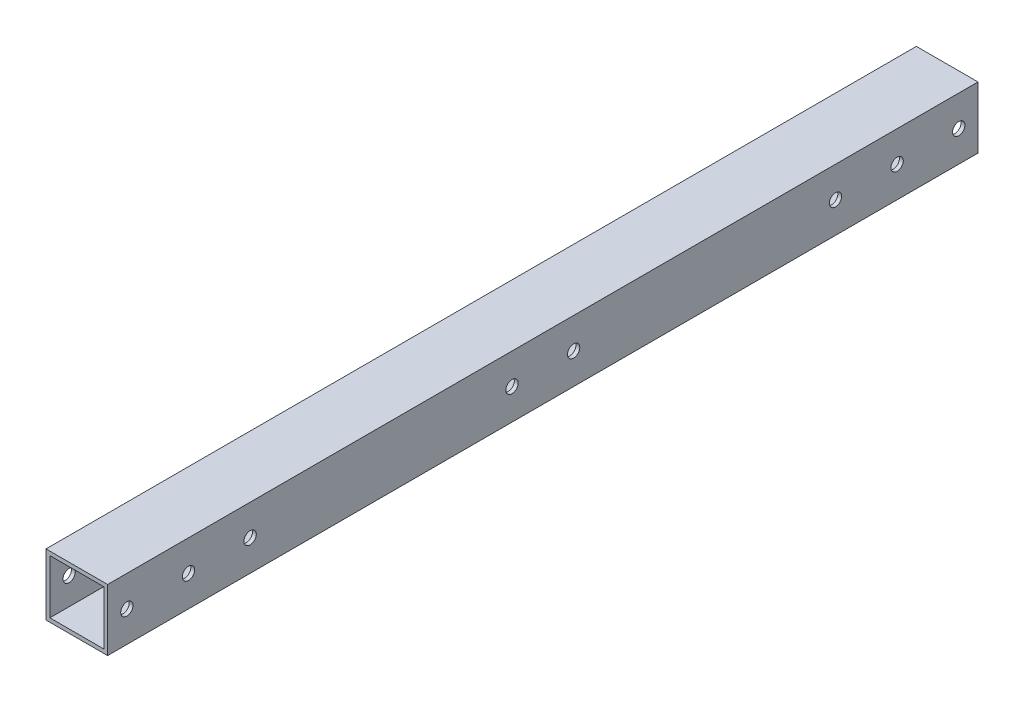
ISO-10303-21;
HEADER;
FILE_DESCRIPTION(('STEP AP214'),'2;1');
FILE_NAME('part.step','',(''),(''),'','','');
FILE_SCHEMA(('AUTOMOTIVE_DESIGN { 1 0 10303 214 1 1 1 1 }'));
ENDSEC;
DATA;
#1=APPLICATION_CONTEXT('core data for automotive mechanical design processes');
#2=APPLICATION_PROTOCOL_DEFINITION('international standard','automotive_design',2000,#1);
#3=PRODUCT_CONTEXT('',#1,'mechanical');
#4=PRODUCT('Part','Part','',(#3));
#5=PRODUCT_RELATED_PRODUCT_CATEGORY('part','',(#4));
#6=PRODUCT_DEFINITION_FORMATION('','',#4);
#7=PRODUCT_DEFINITION_CONTEXT('part definition',#1,'design');
#8=PRODUCT_DEFINITION('design','',#6,#7);
#9=PRODUCT_DEFINITION_SHAPE('','',#8);
#10=(LENGTH_UNIT() NAMED_UNIT(*) SI_UNIT(.MILLI.,.METRE.));
#11=(NAMED_UNIT(*) PLANE_ANGLE_UNIT() SI_UNIT($,.RADIAN.));
#12=(NAMED_UNIT(*) SI_UNIT($,.STERADIAN.) SOLID_ANGLE_UNIT());
#13=UNCERTAINTY_MEASURE_WITH_UNIT(LENGTH_MEASURE(1.E-05),#10,'distance_accuracy_value','');
#14=(GEOMETRIC_REPRESENTATION_CONTEXT(3) GLOBAL_UNCERTAINTY_ASSIGNED_CONTEXT((#13)) GLOBAL_UNIT_ASSIGNED_CONTEXT((#10,
#11,#12)) REPRESENTATION_CONTEXT('',''));
#15=CARTESIAN_POINT('',(0.,0.,0.));
#16=DIRECTION('',(0.,0.,1.));
#17=DIRECTION('',(1.,0.,0.));
#18=AXIS2_PLACEMENT_3D('',#15,#16,#17);
#19=CARTESIAN_POINT('',(0.,0.,358.775));
#20=DIRECTION('',(0.,0.,-1.));
#21=DIRECTION('',(-1.,0.,0.));
#22=AXIS2_PLACEMENT_3D('',#19,#20,#21);
#23=PLANE('',#22);
#24=DIRECTION('',(0.,-1.,0.));
#25=VECTOR('',#24,1.);
#26=CARTESIAN_POINT('',(0.,0.,358.775));
#27=LINE('',#26,#25);
#28=CARTESIAN_POINT('',(0.,25.4,358.775));
#29=VERTEX_POINT('',#28);
#30=CARTESIAN_POINT('',(0.,0.,358.775));
#31=VERTEX_POINT('',#30);
#32=EDGE_CURVE('E157',#29,#31,#27,.T.);
#33=ORIENTED_EDGE('',*,*,#32,.T.);
#34=DIRECTION('',(1.,0.,0.));
#35=VECTOR('',#34,1.);
#36=CARTESIAN_POINT('',(0.,0.,358.775));
#37=LINE('',#36,#35);
#38=CARTESIAN_POINT('',(25.4,0.,358.775));
#39=VERTEX_POINT('',#38);
#40=EDGE_CURVE('E161',#31,#39,#37,.T.);
#41=ORIENTED_EDGE('',*,*,#40,.T.);
#42=DIRECTION('',(0.,1.,0.));
#43=VECTOR('',#42,1.);
#44=CARTESIAN_POINT('',(25.4,0.,358.775));
#45=LINE('',#44,#43);
#46=CARTESIAN_POINT('',(25.4,25.4,358.775));
#47=VERTEX_POINT('',#46);
#48=EDGE_CURVE('E165',#39,#47,#45,.T.);
#49=ORIENTED_EDGE('',*,*,#48,.T.);
#50=DIRECTION('',(-1.,0.,0.));
#51=VECTOR('',#50,1.);
#52=CARTESIAN_POINT('',(0.,25.4,358.775));
#53=LINE('',#52,#51);
#54=EDGE_CURVE('E168',#47,#29,#53,.T.);
#55=ORIENTED_EDGE('',*,*,#54,.T.);
#56=EDGE_LOOP('',(#33,#41,#49,#55));
#57=FACE_BOUND('',#56,.T.);
#58=DIRECTION('',(0.,-1.,0.));
#59=VECTOR('',#58,1.);
#60=CARTESIAN_POINT('',(1.5875,1.5875,358.775));
#61=LINE('',#60,#59);
#62=CARTESIAN_POINT('',(1.5875,23.8125,358.775));
#63=VERTEX_POINT('',#62);
#64=CARTESIAN_POINT('',(1.5875,1.5875,358.775));
#65=VERTEX_POINT('',#64);
#66=EDGE_CURVE('E107',#63,#65,#61,.T.);
#67=ORIENTED_EDGE('',*,*,#66,.F.);
#68=DIRECTION('',(-1.,0.,0.));
#69=VECTOR('',#68,1.);
#70=CARTESIAN_POINT('',(1.5875,23.8125,358.775));
#71=LINE('',#70,#69);
#72=CARTESIAN_POINT('',(23.8125,23.8125,358.775));
#73=VERTEX_POINT('',#72);
#74=EDGE_CURVE('E133',#73,#63,#71,.T.);
#75=ORIENTED_EDGE('',*,*,#74,.F.);
#76=DIRECTION('',(0.,1.,0.));
#77=VECTOR('',#76,1.);
#78=CARTESIAN_POINT('',(23.8125,1.5875,358.775));
#79=LINE('',#78,#77);
#80=CARTESIAN_POINT('',(23.8125,1.5875,358.775));
#81=VERTEX_POINT('',#80);
#82=EDGE_CURVE('E129',#81,#73,#79,.T.);
#83=ORIENTED_EDGE('',*,*,#82,.F.);
#84=DIRECTION('',(1.,0.,0.));
#85=VECTOR('',#84,1.);
#86=CARTESIAN_POINT('',(1.5875,1.5875,358.775));
#87=LINE('',#86,#85);
#88=EDGE_CURVE('E116',#65,#81,#87,.T.);
#89=ORIENTED_EDGE('',*,*,#88,.F.);
#90=EDGE_LOOP('',(#67,#75,#83,#89));
#91=FACE_BOUND('',#90,.T.);
#92=ADVANCED_FACE('F39',(#57,#91),#23,.F.);
#93=CARTESIAN_POINT('',(0.,0.,0.));
#94=DIRECTION('',(0.,0.,-1.));
#95=DIRECTION('',(-1.,0.,0.));
#96=AXIS2_PLACEMENT_3D('',#93,#94,#95);
#97=PLANE('',#96);
#98=DIRECTION('',(0.,-1.,0.));
#99=VECTOR('',#98,1.);
#100=CARTESIAN_POINT('',(0.,0.,0.));
#101=LINE('',#100,#99);
#102=CARTESIAN_POINT('',(0.,25.4,0.));
#103=VERTEX_POINT('',#102);
#104=CARTESIAN_POINT('',(0.,0.,0.));
#105=VERTEX_POINT('',#104);
#106=EDGE_CURVE('E125',#103,#105,#101,.T.);
#107=ORIENTED_EDGE('',*,*,#106,.F.);
#108=DIRECTION('',(-1.,0.,0.));
#109=VECTOR('',#108,1.);
#110=CARTESIAN_POINT('',(0.,25.4,0.));
#111=LINE('',#110,#109);
#112=CARTESIAN_POINT('',(25.4,25.4,0.));
#113=VERTEX_POINT('',#112);
#114=EDGE_CURVE('E162',#113,#103,#111,.T.);
#115=ORIENTED_EDGE('',*,*,#114,.F.);
#116=DIRECTION('',(0.,1.,0.));
#117=VECTOR('',#116,1.);
#118=CARTESIAN_POINT('',(25.4,0.,0.));
#119=LINE('',#118,#117);
#120=CARTESIAN_POINT('',(25.4,0.,0.));
#121=VERTEX_POINT('',#120);
#122=EDGE_CURVE('E178',#121,#113,#119,.T.);
#123=ORIENTED_EDGE('',*,*,#122,.F.);
#124=DIRECTION('',(1.,0.,0.));
#125=VECTOR('',#124,1.);
#126=CARTESIAN_POINT('',(0.,0.,0.));
#127=LINE('',#126,#125);
#128=EDGE_CURVE('E175',#105,#121,#127,.T.);
#129=ORIENTED_EDGE('',*,*,#128,.F.);
#130=EDGE_LOOP('',(#107,#115,#123,#129));
#131=FACE_BOUND('',#130,.T.);
#132=DIRECTION('',(-1.,0.,0.));
#133=VECTOR('',#132,1.);
#134=CARTESIAN_POINT('',(1.5875,23.8125,0.));
#135=LINE('',#134,#133);
#136=CARTESIAN_POINT('',(23.8125,23.8125,0.));
#137=VERTEX_POINT('',#136);
#138=CARTESIAN_POINT('',(1.5875,23.8125,0.));
#139=VERTEX_POINT('',#138);
#140=EDGE_CURVE('E117',#137,#139,#135,.T.);
#141=ORIENTED_EDGE('',*,*,#140,.T.);
#142=DIRECTION('',(0.,-1.,0.));
#143=VECTOR('',#142,1.);
#144=CARTESIAN_POINT('',(1.5875,1.5875,0.));
#145=LINE('',#144,#143);
#146=CARTESIAN_POINT('',(1.5875,1.5875,0.));
#147=VERTEX_POINT('',#146);
#148=EDGE_CURVE('E65',#139,#147,#145,.T.);
#149=ORIENTED_EDGE('',*,*,#148,.T.);
#150=DIRECTION('',(1.,0.,0.));
#151=VECTOR('',#150,1.);
#152=CARTESIAN_POINT('',(1.5875,1.5875,0.));
#153=LINE('',#152,#151);
#154=CARTESIAN_POINT('',(23.8125,1.5875,0.));
#155=VERTEX_POINT('',#154);
#156=EDGE_CURVE('E123',#147,#155,#153,.T.);
#157=ORIENTED_EDGE('',*,*,#156,.T.);
#158=DIRECTION('',(0.,1.,0.));
#159=VECTOR('',#158,1.);
#160=CARTESIAN_POINT('',(23.8125,1.5875,0.));
#161=LINE('',#160,#159);
#162=EDGE_CURVE('E144',#155,#137,#161,.T.);
#163=ORIENTED_EDGE('',*,*,#162,.T.);
#164=EDGE_LOOP('',(#141,#149,#157,#163));
#165=FACE_BOUND('',#164,.T.);
#166=ADVANCED_FACE('F270',(#131,#165),#97,.T.);
#167=CARTESIAN_POINT('',(0.,0.,358.775));
#168=DIRECTION('',(1.,0.,0.));
#169=DIRECTION('',(0.,0.,-1.));
#170=AXIS2_PLACEMENT_3D('',#167,#168,#169);
#171=PLANE('',#170);
#172=CARTESIAN_POINT('',(0.,12.7,350.8375));
#173=DIRECTION('',(1.,0.,0.));
#174=DIRECTION('',(0.,0.,-1.));
#175=AXIS2_PLACEMENT_3D('',#172,#173,#174);
#176=CIRCLE('',#175,2.54000000000001);
#177=CARTESIAN_POINT('',(0.,12.7,348.2975));
#178=VERTEX_POINT('',#177);
#179=EDGE_CURVE('E198',#178,#178,#176,.T.);
#180=ORIENTED_EDGE('',*,*,#179,.T.);
#181=EDGE_LOOP('',(#180));
#182=FACE_BOUND('',#181,.T.);
#183=CARTESIAN_POINT('',(0.,12.7,325.4375));
#184=DIRECTION('',(1.,0.,0.));
#185=DIRECTION('',(0.,0.,-1.));
#186=AXIS2_PLACEMENT_3D('',#183,#184,#185);
#187=CIRCLE('',#186,2.54000000000001);
#188=CARTESIAN_POINT('',(0.,12.7,322.8975));
#189=VERTEX_POINT('',#188);
#190=EDGE_CURVE('E326',#189,#189,#187,.T.);
#191=ORIENTED_EDGE('',*,*,#190,.T.);
#192=EDGE_LOOP('',(#191));
#193=FACE_BOUND('',#192,.T.);
#194=CARTESIAN_POINT('',(0.,12.7,300.0375));
#195=DIRECTION('',(1.,0.,0.));
#196=DIRECTION('',(0.,0.,-1.));
#197=AXIS2_PLACEMENT_3D('',#194,#195,#196);
#198=CIRCLE('',#197,2.54000000000001);
#199=CARTESIAN_POINT('',(0.,12.7,297.4975));
#200=VERTEX_POINT('',#199);
#201=EDGE_CURVE('E330',#200,#200,#198,.T.);
#202=ORIENTED_EDGE('',*,*,#201,.T.);
#203=EDGE_LOOP('',(#202));
#204=FACE_BOUND('',#203,.T.);
#205=CARTESIAN_POINT('',(0.,12.7,192.0875));
#206=DIRECTION('',(1.,0.,0.));
#207=DIRECTION('',(0.,0.,-1.));
#208=AXIS2_PLACEMENT_3D('',#205,#206,#207);
#209=CIRCLE('',#208,2.53999999999998);
#210=CARTESIAN_POINT('',(0.,12.7,189.5475));
#211=VERTEX_POINT('',#210);
#212=EDGE_CURVE('E334',#211,#211,#209,.T.);
#213=ORIENTED_EDGE('',*,*,#212,.T.);
#214=EDGE_LOOP('',(#213));
#215=FACE_BOUND('',#214,.T.);
#216=CARTESIAN_POINT('',(0.,12.7,166.6875));
#217=DIRECTION('',(1.,0.,0.));
#218=DIRECTION('',(0.,0.,1.));
#219=AXIS2_PLACEMENT_3D('',#216,#217,#218);
#220=CIRCLE('',#219,2.53999999999998);
#221=CARTESIAN_POINT('',(0.,12.7,169.2275));
#222=VERTEX_POINT('',#221);
#223=EDGE_CURVE('E338',#222,#222,#220,.T.);
#224=ORIENTED_EDGE('',*,*,#223,.T.);
#225=EDGE_LOOP('',(#224));
#226=FACE_BOUND('',#225,.T.);
#227=CARTESIAN_POINT('',(0.,12.7,58.7374999999999));
#228=DIRECTION('',(1.,0.,0.));
#229=DIRECTION('',(0.,0.,1.));
#230=AXIS2_PLACEMENT_3D('',#227,#228,#229);
#231=CIRCLE('',#230,2.54000000000001);
#232=CARTESIAN_POINT('',(0.,12.7,61.2774999999999));
#233=VERTEX_POINT('',#232);
#234=EDGE_CURVE('E342',#233,#233,#231,.T.);
#235=ORIENTED_EDGE('',*,*,#234,.T.);
#236=EDGE_LOOP('',(#235));
#237=FACE_BOUND('',#236,.T.);
#238=CARTESIAN_POINT('',(0.,12.7,33.3375));
#239=DIRECTION('',(1.,0.,0.));
#240=DIRECTION('',(0.,0.,1.));
#241=AXIS2_PLACEMENT_3D('',#238,#239,#240);
#242=CIRCLE('',#241,2.53999999999998);
#243=CARTESIAN_POINT('',(0.,12.7,35.8774999999999));
#244=VERTEX_POINT('',#243);
#245=EDGE_CURVE('E346',#244,#244,#242,.T.);
#246=ORIENTED_EDGE('',*,*,#245,.T.);
#247=EDGE_LOOP('',(#246));
#248=FACE_BOUND('',#247,.T.);
#249=CARTESIAN_POINT('',(0.,12.7,7.93749999999999));
#250=DIRECTION('',(1.,0.,0.));
#251=DIRECTION('',(0.,0.,1.));
#252=AXIS2_PLACEMENT_3D('',#249,#250,#251);
#253=CIRCLE('',#252,2.53999999999998);
#254=CARTESIAN_POINT('',(0.,12.7,10.4775));
#255=VERTEX_POINT('',#254);
#256=EDGE_CURVE('E349',#255,#255,#253,.T.);
#257=ORIENTED_EDGE('',*,*,#256,.T.);
#258=EDGE_LOOP('',(#257));
#259=FACE_BOUND('',#258,.T.);
#260=ORIENTED_EDGE('',*,*,#106,.T.);
#261=DIRECTION('',(0.,0.,-1.));
#262=VECTOR('',#261,1.);
#263=CARTESIAN_POINT('',(0.,0.,358.775));
#264=LINE('',#263,#262);
#265=EDGE_CURVE('E11',#31,#105,#264,.T.);
#266=ORIENTED_EDGE('',*,*,#265,.F.);
#267=ORIENTED_EDGE('',*,*,#32,.F.);
#268=DIRECTION('',(0.,0.,-1.));
#269=VECTOR('',#268,1.);
#270=CARTESIAN_POINT('',(0.,25.4,358.775));
#271=LINE('',#270,#269);
#272=EDGE_CURVE('E171',#29,#103,#271,.T.);
#273=ORIENTED_EDGE('',*,*,#272,.T.);
#274=EDGE_LOOP('',(#260,#266,#267,#273));
#275=FACE_BOUND('',#274,.T.);
#276=ADVANCED_FACE('F41',(#182,#193,#204,#215,#226,#237,#248,#259,#275),#171,.F.);
#277=CARTESIAN_POINT('',(0.,0.,358.775));
#278=DIRECTION('',(0.,1.,0.));
#279=DIRECTION('',(0.,0.,1.));
#280=AXIS2_PLACEMENT_3D('',#277,#278,#279);
#281=PLANE('',#280);
#282=ORIENTED_EDGE('',*,*,#128,.T.);
#283=DIRECTION('',(0.,0.,-1.));
#284=VECTOR('',#283,1.);
#285=CARTESIAN_POINT('',(25.4,0.,358.775));
#286=LINE('',#285,#284);
#287=EDGE_CURVE('E49',#39,#121,#286,.T.);
#288=ORIENTED_EDGE('',*,*,#287,.F.);
#289=ORIENTED_EDGE('',*,*,#40,.F.);
#290=ORIENTED_EDGE('',*,*,#265,.T.);
#291=EDGE_LOOP('',(#282,#288,#289,#290));
#292=FACE_BOUND('',#291,.T.);
#293=ADVANCED_FACE('F298',(#292),#281,.F.);
#294=CARTESIAN_POINT('',(25.4,0.,358.775));
#295=DIRECTION('',(-1.,0.,0.));
#296=DIRECTION('',(0.,0.,1.));
#297=AXIS2_PLACEMENT_3D('',#294,#295,#296);
#298=PLANE('',#297);
#299=CARTESIAN_POINT('',(25.4,12.7,350.8375));
#300=DIRECTION('',(1.,0.,0.));
#301=DIRECTION('',(0.,0.,-1.));
#302=AXIS2_PLACEMENT_3D('',#299,#300,#301);
#303=CIRCLE('',#302,2.54000000000001);
#304=CARTESIAN_POINT('',(25.4,12.7,348.2975));
#305=VERTEX_POINT('',#304);
#306=EDGE_CURVE('E434',#305,#305,#303,.T.);
#307=ORIENTED_EDGE('',*,*,#306,.F.);
#308=EDGE_LOOP('',(#307));
#309=FACE_BOUND('',#308,.T.);
#310=CARTESIAN_POINT('',(25.4,12.7,325.4375));
#311=DIRECTION('',(1.,0.,0.));
#312=DIRECTION('',(0.,0.,-1.));
#313=AXIS2_PLACEMENT_3D('',#310,#311,#312);
#314=CIRCLE('',#313,2.54000000000001);
#315=CARTESIAN_POINT('',(25.4,12.7,322.8975));
#316=VERTEX_POINT('',#315);
#317=EDGE_CURVE('E435',#316,#316,#314,.T.);
#318=ORIENTED_EDGE('',*,*,#317,.F.);
#319=EDGE_LOOP('',(#318));
#320=FACE_BOUND('',#319,.T.);
#321=CARTESIAN_POINT('',(25.4,12.7,300.0375));
#322=DIRECTION('',(1.,0.,0.));
#323=DIRECTION('',(0.,0.,-1.));
#324=AXIS2_PLACEMENT_3D('',#321,#322,#323);
#325=CIRCLE('',#324,2.54000000000001);
#326=CARTESIAN_POINT('',(25.4,12.7,297.4975));
#327=VERTEX_POINT('',#326);
#328=EDGE_CURVE('E447',#327,#327,#325,.T.);
#329=ORIENTED_EDGE('',*,*,#328,.F.);
#330=EDGE_LOOP('',(#329));
#331=FACE_BOUND('',#330,.T.);
#332=CARTESIAN_POINT('',(25.4,12.7,192.0875));
#333=DIRECTION('',(1.,0.,0.));
#334=DIRECTION('',(0.,0.,-1.));
#335=AXIS2_PLACEMENT_3D('',#332,#333,#334);
#336=CIRCLE('',#335,2.53999999999998);
#337=CARTESIAN_POINT('',(25.4,12.7,189.5475));
#338=VERTEX_POINT('',#337);
#339=EDGE_CURVE('E453',#338,#338,#336,.T.);
#340=ORIENTED_EDGE('',*,*,#339,.F.);
#341=EDGE_LOOP('',(#340));
#342=FACE_BOUND('',#341,.T.);
#343=CARTESIAN_POINT('',(25.4,12.7,166.6875));
#344=DIRECTION('',(1.,0.,0.));
#345=DIRECTION('',(0.,0.,1.));
#346=AXIS2_PLACEMENT_3D('',#343,#344,#345);
#347=CIRCLE('',#346,2.53999999999998);
#348=CARTESIAN_POINT('',(25.4,12.7,169.2275));
#349=VERTEX_POINT('',#348);
#350=EDGE_CURVE('E459',#349,#349,#347,.T.);
#351=ORIENTED_EDGE('',*,*,#350,.F.);
#352=EDGE_LOOP('',(#351));
#353=FACE_BOUND('',#352,.T.);
#354=CARTESIAN_POINT('',(25.4,12.7,58.7374999999999));
#355=DIRECTION('',(1.,0.,0.));
#356=DIRECTION('',(0.,0.,1.));
#357=AXIS2_PLACEMENT_3D('',#354,#355,#356);
#358=CIRCLE('',#357,2.54000000000001);
#359=CARTESIAN_POINT('',(25.4,12.7,61.2774999999999));
#360=VERTEX_POINT('',#359);
#361=EDGE_CURVE('E465',#360,#360,#358,.T.);
#362=ORIENTED_EDGE('',*,*,#361,.F.);
#363=EDGE_LOOP('',(#362));
#364=FACE_BOUND('',#363,.T.);
#365=CARTESIAN_POINT('',(25.4,12.7,33.3375));
#366=DIRECTION('',(1.,0.,0.));
#367=DIRECTION('',(0.,0.,1.));
#368=AXIS2_PLACEMENT_3D('',#365,#366,#367);
#369=CIRCLE('',#368,2.53999999999998);
#370=CARTESIAN_POINT('',(25.4,12.7,35.8774999999999));
#371=VERTEX_POINT('',#370);
#372=EDGE_CURVE('E352',#371,#371,#369,.T.);
#373=ORIENTED_EDGE('',*,*,#372,.F.);
#374=EDGE_LOOP('',(#373));
#375=FACE_BOUND('',#374,.T.);
#376=CARTESIAN_POINT('',(25.4,12.7,7.93749999999999));
#377=DIRECTION('',(1.,0.,0.));
#378=DIRECTION('',(0.,0.,1.));
#379=AXIS2_PLACEMENT_3D('',#376,#377,#378);
#380=CIRCLE('',#379,2.53999999999998);
#381=CARTESIAN_POINT('',(25.4,12.7,10.4775));
#382=VERTEX_POINT('',#381);
#383=EDGE_CURVE('E353',#382,#382,#380,.T.);
#384=ORIENTED_EDGE('',*,*,#383,.F.);
#385=EDGE_LOOP('',(#384));
#386=FACE_BOUND('',#385,.T.);
#387=ORIENTED_EDGE('',*,*,#122,.T.);
#388=DIRECTION('',(0.,0.,-1.));
#389=VECTOR('',#388,1.);
#390=CARTESIAN_POINT('',(25.4,25.4,358.775));
#391=LINE('',#390,#389);
#392=EDGE_CURVE('E186',#47,#113,#391,.T.);
#393=ORIENTED_EDGE('',*,*,#392,.F.);
#394=ORIENTED_EDGE('',*,*,#48,.F.);
#395=ORIENTED_EDGE('',*,*,#287,.T.);
#396=EDGE_LOOP('',(#387,#393,#394,#395));
#397=FACE_BOUND('',#396,.T.);
#398=ADVANCED_FACE('F295',(#309,#320,#331,#342,#353,#364,#375,#386,#397),#298,.F.);
#399=CARTESIAN_POINT('',(0.,25.4,358.775));
#400=DIRECTION('',(0.,-1.,0.));
#401=DIRECTION('',(0.,0.,-1.));
#402=AXIS2_PLACEMENT_3D('',#399,#400,#401);
#403=PLANE('',#402);
#404=ORIENTED_EDGE('',*,*,#114,.T.);
#405=ORIENTED_EDGE('',*,*,#272,.F.);
#406=ORIENTED_EDGE('',*,*,#54,.F.);
#407=ORIENTED_EDGE('',*,*,#392,.T.);
#408=EDGE_LOOP('',(#404,#405,#406,#407));
#409=FACE_BOUND('',#408,.T.);
#410=ADVANCED_FACE('F292',(#409),#403,.F.);
#411=CARTESIAN_POINT('',(1.5875,1.5875,358.775));
#412=DIRECTION('',(1.,0.,0.));
#413=DIRECTION('',(0.,0.,-1.));
#414=AXIS2_PLACEMENT_3D('',#411,#412,#413);
#415=PLANE('',#414);
#416=CARTESIAN_POINT('',(1.5875,12.7,350.8375));
#417=DIRECTION('',(1.,0.,0.));
#418=DIRECTION('',(0.,0.,-1.));
#419=AXIS2_PLACEMENT_3D('',#416,#417,#418);
#420=CIRCLE('',#419,2.54000000000001);
#421=CARTESIAN_POINT('',(1.5875,12.7,348.2975));
#422=VERTEX_POINT('',#421);
#423=EDGE_CURVE('E141',#422,#422,#420,.T.);
#424=ORIENTED_EDGE('',*,*,#423,.F.);
#425=EDGE_LOOP('',(#424));
#426=FACE_BOUND('',#425,.T.);
#427=CARTESIAN_POINT('',(1.5875,12.7,325.4375));
#428=DIRECTION('',(1.,0.,0.));
#429=DIRECTION('',(0.,0.,-1.));
#430=AXIS2_PLACEMENT_3D('',#427,#428,#429);
#431=CIRCLE('',#430,2.54000000000001);
#432=CARTESIAN_POINT('',(1.5875,12.7,322.8975));
#433=VERTEX_POINT('',#432);
#434=EDGE_CURVE('E226',#433,#433,#431,.T.);
#435=ORIENTED_EDGE('',*,*,#434,.F.);
#436=EDGE_LOOP('',(#435));
#437=FACE_BOUND('',#436,.T.);
#438=CARTESIAN_POINT('',(1.5875,12.7,300.0375));
#439=DIRECTION('',(1.,0.,0.));
#440=DIRECTION('',(0.,0.,-1.));
#441=AXIS2_PLACEMENT_3D('',#438,#439,#440);
#442=CIRCLE('',#441,2.54000000000001);
#443=CARTESIAN_POINT('',(1.5875,12.7,297.4975));
#444=VERTEX_POINT('',#443);
#445=EDGE_CURVE('E222',#444,#444,#442,.T.);
#446=ORIENTED_EDGE('',*,*,#445,.F.);
#447=EDGE_LOOP('',(#446));
#448=FACE_BOUND('',#447,.T.);
#449=CARTESIAN_POINT('',(1.5875,12.7,192.0875));
#450=DIRECTION('',(1.,0.,0.));
#451=DIRECTION('',(0.,0.,-1.));
#452=AXIS2_PLACEMENT_3D('',#449,#450,#451);
#453=CIRCLE('',#452,2.53999999999998);
#454=CARTESIAN_POINT('',(1.5875,12.7,189.5475));
#455=VERTEX_POINT('',#454);
#456=EDGE_CURVE('E218',#455,#455,#453,.T.);
#457=ORIENTED_EDGE('',*,*,#456,.F.);
#458=EDGE_LOOP('',(#457));
#459=FACE_BOUND('',#458,.T.);
#460=CARTESIAN_POINT('',(1.5875,12.7,166.6875));
#461=DIRECTION('',(1.,0.,0.));
#462=DIRECTION('',(0.,0.,-1.));
#463=AXIS2_PLACEMENT_3D('',#460,#461,#462);
#464=CIRCLE('',#463,2.53999999999998);
#465=CARTESIAN_POINT('',(1.5875,12.7,164.1475));
#466=VERTEX_POINT('',#465);
#467=EDGE_CURVE('E213',#466,#466,#464,.T.);
#468=ORIENTED_EDGE('',*,*,#467,.F.);
#469=EDGE_LOOP('',(#468));
#470=FACE_BOUND('',#469,.T.);
#471=CARTESIAN_POINT('',(1.5875,12.7,58.7374999999999));
#472=DIRECTION('',(1.,0.,0.));
#473=DIRECTION('',(0.,0.,-1.));
#474=AXIS2_PLACEMENT_3D('',#471,#472,#473);
#475=CIRCLE('',#474,2.54000000000001);
#476=CARTESIAN_POINT('',(1.5875,12.7,56.1974999999999));
#477=VERTEX_POINT('',#476);
#478=EDGE_CURVE('E208',#477,#477,#475,.T.);
#479=ORIENTED_EDGE('',*,*,#478,.F.);
#480=EDGE_LOOP('',(#479));
#481=FACE_BOUND('',#480,.T.);
#482=CARTESIAN_POINT('',(1.5875,12.7,33.3375));
#483=DIRECTION('',(1.,0.,0.));
#484=DIRECTION('',(0.,0.,-1.));
#485=AXIS2_PLACEMENT_3D('',#482,#483,#484);
#486=CIRCLE('',#485,2.53999999999998);
#487=CARTESIAN_POINT('',(1.5875,12.7,30.7975));
#488=VERTEX_POINT('',#487);
#489=EDGE_CURVE('E203',#488,#488,#486,.T.);
#490=ORIENTED_EDGE('',*,*,#489,.F.);
#491=EDGE_LOOP('',(#490));
#492=FACE_BOUND('',#491,.T.);
#493=CARTESIAN_POINT('',(1.5875,12.7,7.93749999999999));
#494=DIRECTION('',(1.,0.,0.));
#495=DIRECTION('',(0.,0.,-1.));
#496=AXIS2_PLACEMENT_3D('',#493,#494,#495);
#497=CIRCLE('',#496,2.53999999999998);
#498=CARTESIAN_POINT('',(1.5875,12.7,5.3975));
#499=VERTEX_POINT('',#498);
#500=EDGE_CURVE('E197',#499,#499,#497,.T.);
#501=ORIENTED_EDGE('',*,*,#500,.F.);
#502=EDGE_LOOP('',(#501));
#503=FACE_BOUND('',#502,.T.);
#504=ORIENTED_EDGE('',*,*,#148,.F.);
#505=DIRECTION('',(0.,0.,-1.));
#506=VECTOR('',#505,1.);
#507=CARTESIAN_POINT('',(1.5875,23.8125,358.775));
#508=LINE('',#507,#506);
#509=EDGE_CURVE('E111',#63,#139,#508,.T.);
#510=ORIENTED_EDGE('',*,*,#509,.F.);
#511=ORIENTED_EDGE('',*,*,#66,.T.);
#512=DIRECTION('',(0.,0.,-1.));
#513=VECTOR('',#512,1.);
#514=CARTESIAN_POINT('',(1.5875,1.5875,358.775));
#515=LINE('',#514,#513);
#516=EDGE_CURVE('E110',#65,#147,#515,.T.);
#517=ORIENTED_EDGE('',*,*,#516,.T.);
#518=EDGE_LOOP('',(#504,#510,#511,#517));
#519=FACE_BOUND('',#518,.T.);
#520=ADVANCED_FACE('F109',(#426,#437,#448,#459,#470,#481,#492,#503,#519),#415,.T.);
#521=CARTESIAN_POINT('',(1.5875,1.5875,358.775));
#522=DIRECTION('',(0.,1.,0.));
#523=DIRECTION('',(0.,0.,1.));
#524=AXIS2_PLACEMENT_3D('',#521,#522,#523);
#525=PLANE('',#524);
#526=ORIENTED_EDGE('',*,*,#156,.F.);
#527=ORIENTED_EDGE('',*,*,#516,.F.);
#528=ORIENTED_EDGE('',*,*,#88,.T.);
#529=DIRECTION('',(0.,0.,-1.));
#530=VECTOR('',#529,1.);
#531=CARTESIAN_POINT('',(23.8125,1.5875,358.775));
#532=LINE('',#531,#530);
#533=EDGE_CURVE('E126',#81,#155,#532,.T.);
#534=ORIENTED_EDGE('',*,*,#533,.T.);
#535=EDGE_LOOP('',(#526,#527,#528,#534));
#536=FACE_BOUND('',#535,.T.);
#537=ADVANCED_FACE('F120',(#536),#525,.T.);
#538=CARTESIAN_POINT('',(23.8125,1.5875,358.775));
#539=DIRECTION('',(-1.,0.,0.));
#540=DIRECTION('',(0.,0.,1.));
#541=AXIS2_PLACEMENT_3D('',#538,#539,#540);
#542=PLANE('',#541);
#543=CARTESIAN_POINT('',(23.8125,12.7,350.8375));
#544=DIRECTION('',(-1.,0.,0.));
#545=DIRECTION('',(0.,0.,1.));
#546=AXIS2_PLACEMENT_3D('',#543,#544,#545);
#547=CIRCLE('',#546,2.54000000000001);
#548=CARTESIAN_POINT('',(23.8125,12.7,353.3775));
#549=VERTEX_POINT('',#548);
#550=EDGE_CURVE('E43',#549,#549,#547,.T.);
#551=ORIENTED_EDGE('',*,*,#550,.F.);
#552=EDGE_LOOP('',(#551));
#553=FACE_BOUND('',#552,.T.);
#554=CARTESIAN_POINT('',(23.8125,12.7,325.4375));
#555=DIRECTION('',(-1.,0.,0.));
#556=DIRECTION('',(0.,0.,1.));
#557=AXIS2_PLACEMENT_3D('',#554,#555,#556);
#558=CIRCLE('',#557,2.54000000000001);
#559=CARTESIAN_POINT('',(23.8125,12.7,327.9775));
#560=VERTEX_POINT('',#559);
#561=EDGE_CURVE('E223',#560,#560,#558,.T.);
#562=ORIENTED_EDGE('',*,*,#561,.F.);
#563=EDGE_LOOP('',(#562));
#564=FACE_BOUND('',#563,.T.);
#565=CARTESIAN_POINT('',(23.8125,12.7,300.0375));
#566=DIRECTION('',(-1.,0.,0.));
#567=DIRECTION('',(0.,0.,1.));
#568=AXIS2_PLACEMENT_3D('',#565,#566,#567);
#569=CIRCLE('',#568,2.54000000000001);
#570=CARTESIAN_POINT('',(23.8125,12.7,302.5775));
#571=VERTEX_POINT('',#570);
#572=EDGE_CURVE('E219',#571,#571,#569,.T.);
#573=ORIENTED_EDGE('',*,*,#572,.F.);
#574=EDGE_LOOP('',(#573));
#575=FACE_BOUND('',#574,.T.);
#576=CARTESIAN_POINT('',(23.8125,12.7,192.0875));
#577=DIRECTION('',(-1.,0.,0.));
#578=DIRECTION('',(0.,0.,1.));
#579=AXIS2_PLACEMENT_3D('',#576,#577,#578);
#580=CIRCLE('',#579,2.53999999999998);
#581=CARTESIAN_POINT('',(23.8125,12.7,194.6275));
#582=VERTEX_POINT('',#581);
#583=EDGE_CURVE('E214',#582,#582,#580,.T.);
#584=ORIENTED_EDGE('',*,*,#583,.F.);
#585=EDGE_LOOP('',(#584));
#586=FACE_BOUND('',#585,.T.);
#587=CARTESIAN_POINT('',(23.8125,12.7,166.6875));
#588=DIRECTION('',(-1.,0.,0.));
#589=DIRECTION('',(0.,0.,1.));
#590=AXIS2_PLACEMENT_3D('',#587,#588,#589);
#591=CIRCLE('',#590,2.53999999999998);
#592=CARTESIAN_POINT('',(23.8125,12.7,169.2275));
#593=VERTEX_POINT('',#592);
#594=EDGE_CURVE('E209',#593,#593,#591,.T.);
#595=ORIENTED_EDGE('',*,*,#594,.F.);
#596=EDGE_LOOP('',(#595));
#597=FACE_BOUND('',#596,.T.);
#598=CARTESIAN_POINT('',(23.8125,12.7,58.7374999999999));
#599=DIRECTION('',(-1.,0.,0.));
#600=DIRECTION('',(0.,0.,1.));
#601=AXIS2_PLACEMENT_3D('',#598,#599,#600);
#602=CIRCLE('',#601,2.54000000000001);
#603=CARTESIAN_POINT('',(23.8125,12.7,61.2774999999999));
#604=VERTEX_POINT('',#603);
#605=EDGE_CURVE('E204',#604,#604,#602,.T.);
#606=ORIENTED_EDGE('',*,*,#605,.F.);
#607=EDGE_LOOP('',(#606));
#608=FACE_BOUND('',#607,.T.);
#609=CARTESIAN_POINT('',(23.8125,12.7,33.3375));
#610=DIRECTION('',(-1.,0.,0.));
#611=DIRECTION('',(0.,0.,1.));
#612=AXIS2_PLACEMENT_3D('',#609,#610,#611);
#613=CIRCLE('',#612,2.53999999999998);
#614=CARTESIAN_POINT('',(23.8125,12.7,35.8774999999999));
#615=VERTEX_POINT('',#614);
#616=EDGE_CURVE('E199',#615,#615,#613,.T.);
#617=ORIENTED_EDGE('',*,*,#616,.F.);
#618=EDGE_LOOP('',(#617));
#619=FACE_BOUND('',#618,.T.);
#620=CARTESIAN_POINT('',(23.8125,12.7,7.93749999999999));
#621=DIRECTION('',(-1.,0.,0.));
#622=DIRECTION('',(0.,0.,1.));
#623=AXIS2_PLACEMENT_3D('',#620,#621,#622);
#624=CIRCLE('',#623,2.53999999999998);
#625=CARTESIAN_POINT('',(23.8125,12.7,10.4775));
#626=VERTEX_POINT('',#625);
#627=EDGE_CURVE('E193',#626,#626,#624,.T.);
#628=ORIENTED_EDGE('',*,*,#627,.F.);
#629=EDGE_LOOP('',(#628));
#630=FACE_BOUND('',#629,.T.);
#631=ORIENTED_EDGE('',*,*,#162,.F.);
#632=ORIENTED_EDGE('',*,*,#533,.F.);
#633=ORIENTED_EDGE('',*,*,#82,.T.);
#634=DIRECTION('',(0.,0.,-1.));
#635=VECTOR('',#634,1.);
#636=CARTESIAN_POINT('',(23.8125,23.8125,358.775));
#637=LINE('',#636,#635);
#638=EDGE_CURVE('E57',#73,#137,#637,.T.);
#639=ORIENTED_EDGE('',*,*,#638,.T.);
#640=EDGE_LOOP('',(#631,#632,#633,#639));
#641=FACE_BOUND('',#640,.T.);
#642=ADVANCED_FACE('F250',(#553,#564,#575,#586,#597,#608,#619,#630,#641),#542,.T.);
#643=CARTESIAN_POINT('',(1.5875,23.8125,358.775));
#644=DIRECTION('',(0.,-1.,0.));
#645=DIRECTION('',(0.,0.,-1.));
#646=AXIS2_PLACEMENT_3D('',#643,#644,#645);
#647=PLANE('',#646);
#648=ORIENTED_EDGE('',*,*,#140,.F.);
#649=ORIENTED_EDGE('',*,*,#638,.F.);
#650=ORIENTED_EDGE('',*,*,#74,.T.);
#651=ORIENTED_EDGE('',*,*,#509,.T.);
#652=EDGE_LOOP('',(#648,#649,#650,#651));
#653=FACE_BOUND('',#652,.T.);
#654=ADVANCED_FACE('F253',(#653),#647,.T.);
#655=CARTESIAN_POINT('',(0.,12.7,7.93749999999999));
#656=DIRECTION('',(1.,0.,0.));
#657=DIRECTION('',(0.,0.,-1.));
#658=AXIS2_PLACEMENT_3D('',#655,#656,#657);
#659=CYLINDRICAL_SURFACE('',#658,2.53999999999998);
#660=ORIENTED_EDGE('',*,*,#627,.T.);
#661=EDGE_LOOP('',(#660));
#662=FACE_BOUND('',#661,.T.);
#663=ORIENTED_EDGE('',*,*,#383,.T.);
#664=EDGE_LOOP('',(#663));
#665=FACE_BOUND('',#664,.T.);
#666=ADVANCED_FACE('F272',(#662,#665),#659,.F.);
#667=CARTESIAN_POINT('',(0.,12.7,33.3375));
#668=DIRECTION('',(1.,0.,0.));
#669=DIRECTION('',(0.,0.,-1.));
#670=AXIS2_PLACEMENT_3D('',#667,#668,#669);
#671=CYLINDRICAL_SURFACE('',#670,2.53999999999998);
#672=ORIENTED_EDGE('',*,*,#616,.T.);
#673=EDGE_LOOP('',(#672));
#674=FACE_BOUND('',#673,.T.);
#675=ORIENTED_EDGE('',*,*,#372,.T.);
#676=EDGE_LOOP('',(#675));
#677=FACE_BOUND('',#676,.T.);
#678=ADVANCED_FACE('F277',(#674,#677),#671,.F.);
#679=CARTESIAN_POINT('',(0.,12.7,58.7374999999999));
#680=DIRECTION('',(1.,0.,0.));
#681=DIRECTION('',(0.,0.,-1.));
#682=AXIS2_PLACEMENT_3D('',#679,#680,#681);
#683=CYLINDRICAL_SURFACE('',#682,2.54000000000001);
#684=ORIENTED_EDGE('',*,*,#605,.T.);
#685=EDGE_LOOP('',(#684));
#686=FACE_BOUND('',#685,.T.);
#687=ORIENTED_EDGE('',*,*,#361,.T.);
#688=EDGE_LOOP('',(#687));
#689=FACE_BOUND('',#688,.T.);
#690=ADVANCED_FACE('F401',(#686,#689),#683,.F.);
#691=CARTESIAN_POINT('',(0.,12.7,166.6875));
#692=DIRECTION('',(1.,0.,0.));
#693=DIRECTION('',(0.,0.,-1.));
#694=AXIS2_PLACEMENT_3D('',#691,#692,#693);
#695=CYLINDRICAL_SURFACE('',#694,2.53999999999998);
#696=ORIENTED_EDGE('',*,*,#594,.T.);
#697=EDGE_LOOP('',(#696));
#698=FACE_BOUND('',#697,.T.);
#699=ORIENTED_EDGE('',*,*,#350,.T.);
#700=EDGE_LOOP('',(#699));
#701=FACE_BOUND('',#700,.T.);
#702=ADVANCED_FACE('F405',(#698,#701),#695,.F.);
#703=CARTESIAN_POINT('',(0.,12.7,192.0875));
#704=DIRECTION('',(1.,0.,0.));
#705=DIRECTION('',(0.,0.,-1.));
#706=AXIS2_PLACEMENT_3D('',#703,#704,#705);
#707=CYLINDRICAL_SURFACE('',#706,2.53999999999998);
#708=ORIENTED_EDGE('',*,*,#583,.T.);
#709=EDGE_LOOP('',(#708));
#710=FACE_BOUND('',#709,.T.);
#711=ORIENTED_EDGE('',*,*,#339,.T.);
#712=EDGE_LOOP('',(#711));
#713=FACE_BOUND('',#712,.T.);
#714=ADVANCED_FACE('F409',(#710,#713),#707,.F.);
#715=CARTESIAN_POINT('',(0.,12.7,300.0375));
#716=DIRECTION('',(1.,0.,0.));
#717=DIRECTION('',(0.,0.,-1.));
#718=AXIS2_PLACEMENT_3D('',#715,#716,#717);
#719=CYLINDRICAL_SURFACE('',#718,2.54000000000001);
#720=ORIENTED_EDGE('',*,*,#572,.T.);
#721=EDGE_LOOP('',(#720));
#722=FACE_BOUND('',#721,.T.);
#723=ORIENTED_EDGE('',*,*,#328,.T.);
#724=EDGE_LOOP('',(#723));
#725=FACE_BOUND('',#724,.T.);
#726=ADVANCED_FACE('F413',(#722,#725),#719,.F.);
#727=CARTESIAN_POINT('',(0.,12.7,325.4375));
#728=DIRECTION('',(1.,0.,0.));
#729=DIRECTION('',(0.,0.,-1.));
#730=AXIS2_PLACEMENT_3D('',#727,#728,#729);
#731=CYLINDRICAL_SURFACE('',#730,2.54000000000001);
#732=ORIENTED_EDGE('',*,*,#561,.T.);
#733=EDGE_LOOP('',(#732));
#734=FACE_BOUND('',#733,.T.);
#735=ORIENTED_EDGE('',*,*,#317,.T.);
#736=EDGE_LOOP('',(#735));
#737=FACE_BOUND('',#736,.T.);
#738=ADVANCED_FACE('F396',(#734,#737),#731,.F.);
#739=CARTESIAN_POINT('',(0.,12.7,350.8375));
#740=DIRECTION('',(1.,0.,0.));
#741=DIRECTION('',(0.,0.,-1.));
#742=AXIS2_PLACEMENT_3D('',#739,#740,#741);
#743=CYLINDRICAL_SURFACE('',#742,2.54000000000001);
#744=ORIENTED_EDGE('',*,*,#550,.T.);
#745=EDGE_LOOP('',(#744));
#746=FACE_BOUND('',#745,.T.);
#747=ORIENTED_EDGE('',*,*,#306,.T.);
#748=EDGE_LOOP('',(#747));
#749=FACE_BOUND('',#748,.T.);
#750=ADVANCED_FACE('F247',(#746,#749),#743,.F.);
#751=ORIENTED_EDGE('',*,*,#500,.T.);
#752=EDGE_LOOP('',(#751));
#753=FACE_BOUND('',#752,.T.);
#754=ORIENTED_EDGE('',*,*,#256,.F.);
#755=EDGE_LOOP('',(#754));
#756=FACE_BOUND('',#755,.T.);
#757=ADVANCED_FACE('F280',(#753,#756),#659,.F.);
#758=ORIENTED_EDGE('',*,*,#489,.T.);
#759=EDGE_LOOP('',(#758));
#760=FACE_BOUND('',#759,.T.);
#761=ORIENTED_EDGE('',*,*,#245,.F.);
#762=EDGE_LOOP('',(#761));
#763=FACE_BOUND('',#762,.T.);
#764=ADVANCED_FACE('F388',(#760,#763),#671,.F.);
#765=ORIENTED_EDGE('',*,*,#478,.T.);
#766=EDGE_LOOP('',(#765));
#767=FACE_BOUND('',#766,.T.);
#768=ORIENTED_EDGE('',*,*,#234,.F.);
#769=EDGE_LOOP('',(#768));
#770=FACE_BOUND('',#769,.T.);
#771=ADVANCED_FACE('F393',(#767,#770),#683,.F.);
#772=ORIENTED_EDGE('',*,*,#467,.T.);
#773=EDGE_LOOP('',(#772));
#774=FACE_BOUND('',#773,.T.);
#775=ORIENTED_EDGE('',*,*,#223,.F.);
#776=EDGE_LOOP('',(#775));
#777=FACE_BOUND('',#776,.T.);
#778=ADVANCED_FACE('F375',(#774,#777),#695,.F.);
#779=ORIENTED_EDGE('',*,*,#456,.T.);
#780=EDGE_LOOP('',(#779));
#781=FACE_BOUND('',#780,.T.);
#782=ORIENTED_EDGE('',*,*,#212,.F.);
#783=EDGE_LOOP('',(#782));
#784=FACE_BOUND('',#783,.T.);
#785=ADVANCED_FACE('F415',(#781,#784),#707,.F.);
#786=ORIENTED_EDGE('',*,*,#445,.T.);
#787=EDGE_LOOP('',(#786));
#788=FACE_BOUND('',#787,.T.);
#789=ORIENTED_EDGE('',*,*,#201,.F.);
#790=EDGE_LOOP('',(#789));
#791=FACE_BOUND('',#790,.T.);
#792=ADVANCED_FACE('F419',(#788,#791),#719,.F.);
#793=ORIENTED_EDGE('',*,*,#434,.T.);
#794=EDGE_LOOP('',(#793));
#795=FACE_BOUND('',#794,.T.);
#796=ORIENTED_EDGE('',*,*,#190,.F.);
#797=EDGE_LOOP('',(#796));
#798=FACE_BOUND('',#797,.T.);
#799=ADVANCED_FACE('F421',(#795,#798),#731,.F.);
#800=ORIENTED_EDGE('',*,*,#423,.T.);
#801=EDGE_LOOP('',(#800));
#802=FACE_BOUND('',#801,.T.);
#803=ORIENTED_EDGE('',*,*,#179,.F.);
#804=EDGE_LOOP('',(#803));
#805=FACE_BOUND('',#804,.T.);
#806=ADVANCED_FACE('F398',(#802,#805),#743,.F.);
#807=CLOSED_SHELL('',(#92,#166,#276,#293,#398,#410,#520,#537,#642,#654,#666,#678,#690,#702,#714,
#726,#738,#750,#757,#764,#771,#778,#785,#792,#799,#806));
#808=MANIFOLD_SOLID_BREP('B2',#807);
#809=ADVANCED_BREP_SHAPE_REPRESENTATION('',(#18,#808),#14);
#810=SHAPE_DEFINITION_REPRESENTATION(#9,#809);
ENDSEC;
END-ISO-10303-21;
